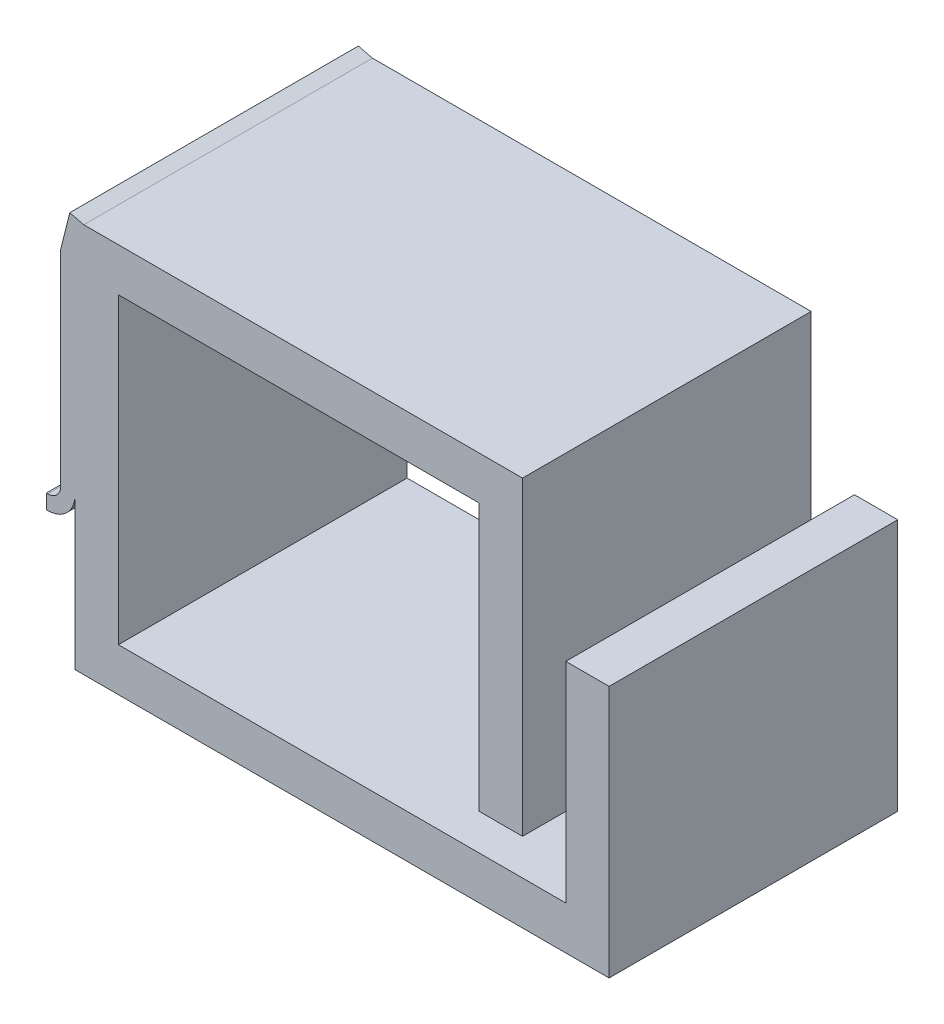
ISO-10303-21;
HEADER;
FILE_DESCRIPTION(('STEP AP214'),'2;1');
FILE_NAME('part.step','',(''),(''),'','','');
FILE_SCHEMA(('AUTOMOTIVE_DESIGN { 1 0 10303 214 1 1 1 1 }'));
ENDSEC;
DATA;
#1=APPLICATION_CONTEXT('core data for automotive mechanical design processes');
#2=APPLICATION_PROTOCOL_DEFINITION('international standard','automotive_design',2000,#1);
#3=PRODUCT_CONTEXT('',#1,'mechanical');
#4=PRODUCT('Part','Part','',(#3));
#5=PRODUCT_RELATED_PRODUCT_CATEGORY('part','',(#4));
#6=PRODUCT_DEFINITION_FORMATION('','',#4);
#7=PRODUCT_DEFINITION_CONTEXT('part definition',#1,'design');
#8=PRODUCT_DEFINITION('design','',#6,#7);
#9=PRODUCT_DEFINITION_SHAPE('','',#8);
#10=(LENGTH_UNIT() NAMED_UNIT(*) SI_UNIT(.MILLI.,.METRE.));
#11=(NAMED_UNIT(*) PLANE_ANGLE_UNIT() SI_UNIT($,.RADIAN.));
#12=(NAMED_UNIT(*) SI_UNIT($,.STERADIAN.) SOLID_ANGLE_UNIT());
#13=UNCERTAINTY_MEASURE_WITH_UNIT(LENGTH_MEASURE(1.E-05),#10,'distance_accuracy_value','');
#14=(GEOMETRIC_REPRESENTATION_CONTEXT(3) GLOBAL_UNCERTAINTY_ASSIGNED_CONTEXT((#13)) GLOBAL_UNIT_ASSIGNED_CONTEXT((#10,
#11,#12)) REPRESENTATION_CONTEXT('',''));
#15=CARTESIAN_POINT('',(0.,0.,0.));
#16=DIRECTION('',(0.,0.,1.));
#17=DIRECTION('',(1.,0.,0.));
#18=AXIS2_PLACEMENT_3D('',#15,#16,#17);
#19=CARTESIAN_POINT('',(-9.31410256410255,-0.450000000000002,10.));
#20=DIRECTION('',(1.,0.,0.));
#21=DIRECTION('',(0.,1.,0.));
#22=AXIS2_PLACEMENT_3D('',#19,#20,#21);
#23=PLANE('',#22);
#24=DIRECTION('',(0.,-1.,0.));
#25=VECTOR('',#24,1.);
#26=CARTESIAN_POINT('',(-9.31410256410255,-0.450000000000002,10.));
#27=LINE('',#26,#25);
#28=CARTESIAN_POINT('',(-9.31410256410255,-7.5,10.));
#29=VERTEX_POINT('',#28);
#30=CARTESIAN_POINT('',(-9.31410256410255,-12.75,10.));
#31=VERTEX_POINT('',#30);
#32=EDGE_CURVE('E108',#29,#31,#27,.T.);
#33=ORIENTED_EDGE('',*,*,#32,.F.);
#34=DIRECTION('',(0.,0.,1.));
#35=VECTOR('',#34,1.);
#36=CARTESIAN_POINT('',(-9.31410256410255,-7.5,0.));
#37=LINE('',#36,#35);
#38=CARTESIAN_POINT('',(-9.31410256410255,-7.5,0.));
#39=VERTEX_POINT('',#38);
#40=EDGE_CURVE('E103',#39,#29,#37,.T.);
#41=ORIENTED_EDGE('',*,*,#40,.F.);
#42=DIRECTION('',(0.,-1.,0.));
#43=VECTOR('',#42,1.);
#44=CARTESIAN_POINT('',(-9.31410256410255,-0.450000000000002,0.));
#45=LINE('',#44,#43);
#46=CARTESIAN_POINT('',(-9.31410256410255,-12.75,0.));
#47=VERTEX_POINT('',#46);
#48=EDGE_CURVE('E328',#39,#47,#45,.T.);
#49=ORIENTED_EDGE('',*,*,#48,.T.);
#50=DIRECTION('',(0.,0.,-1.));
#51=VECTOR('',#50,1.);
#52=CARTESIAN_POINT('',(-9.31410256410255,-12.75,10.));
#53=LINE('',#52,#51);
#54=EDGE_CURVE('E333',#31,#47,#53,.T.);
#55=ORIENTED_EDGE('',*,*,#54,.F.);
#56=EDGE_LOOP('',(#33,#41,#49,#55));
#57=FACE_BOUND('',#56,.T.);
#58=ADVANCED_FACE('F88',(#57),#23,.F.);
#59=CARTESIAN_POINT('',(-8.56410256410255,-12.75,10.));
#60=DIRECTION('',(0.,1.,0.));
#61=DIRECTION('',(0.,0.,1.));
#62=AXIS2_PLACEMENT_3D('',#59,#60,#61);
#63=PLANE('',#62);
#64=DIRECTION('',(1.,0.,0.));
#65=VECTOR('',#64,1.);
#66=CARTESIAN_POINT('',(-8.56410256410255,-12.75,0.));
#67=LINE('',#66,#65);
#68=CARTESIAN_POINT('',(9.18589743589745,-12.75,0.));
#69=VERTEX_POINT('',#68);
#70=EDGE_CURVE('E298',#47,#69,#67,.T.);
#71=ORIENTED_EDGE('',*,*,#70,.T.);
#72=DIRECTION('',(0.,0.,-1.));
#73=VECTOR('',#72,1.);
#74=CARTESIAN_POINT('',(9.18589743589745,-12.75,10.));
#75=LINE('',#74,#73);
#76=CARTESIAN_POINT('',(9.18589743589745,-12.75,10.));
#77=VERTEX_POINT('',#76);
#78=EDGE_CURVE('E312',#77,#69,#75,.T.);
#79=ORIENTED_EDGE('',*,*,#78,.F.);
#80=DIRECTION('',(1.,0.,0.));
#81=VECTOR('',#80,1.);
#82=CARTESIAN_POINT('',(-8.56410256410255,-12.75,10.));
#83=LINE('',#82,#81);
#84=EDGE_CURVE('E310',#31,#77,#83,.T.);
#85=ORIENTED_EDGE('',*,*,#84,.F.);
#86=ORIENTED_EDGE('',*,*,#54,.T.);
#87=EDGE_LOOP('',(#71,#79,#85,#86));
#88=FACE_BOUND('',#87,.T.);
#89=ADVANCED_FACE('F422',(#88),#63,.F.);
#90=CARTESIAN_POINT('',(9.18589743589745,-12.,10.));
#91=DIRECTION('',(-1.,0.,0.));
#92=DIRECTION('',(0.,0.,1.));
#93=AXIS2_PLACEMENT_3D('',#90,#91,#92);
#94=PLANE('',#93);
#95=DIRECTION('',(0.,1.,0.));
#96=VECTOR('',#95,1.);
#97=CARTESIAN_POINT('',(9.18589743589745,-12.,0.));
#98=LINE('',#97,#96);
#99=CARTESIAN_POINT('',(9.18589743589745,-4.,0.));
#100=VERTEX_POINT('',#99);
#101=EDGE_CURVE('E313',#69,#100,#98,.T.);
#102=ORIENTED_EDGE('',*,*,#101,.T.);
#103=DIRECTION('',(0.,0.,-1.));
#104=VECTOR('',#103,1.);
#105=CARTESIAN_POINT('',(9.18589743589745,-4.,10.));
#106=LINE('',#105,#104);
#107=CARTESIAN_POINT('',(9.18589743589745,-4.,10.));
#108=VERTEX_POINT('',#107);
#109=EDGE_CURVE('E96',#108,#100,#106,.T.);
#110=ORIENTED_EDGE('',*,*,#109,.F.);
#111=DIRECTION('',(0.,1.,0.));
#112=VECTOR('',#111,1.);
#113=CARTESIAN_POINT('',(9.18589743589745,-12.,10.));
#114=LINE('',#113,#112);
#115=EDGE_CURVE('E295',#77,#108,#114,.T.);
#116=ORIENTED_EDGE('',*,*,#115,.F.);
#117=ORIENTED_EDGE('',*,*,#78,.T.);
#118=EDGE_LOOP('',(#102,#110,#116,#117));
#119=FACE_BOUND('',#118,.T.);
#120=ADVANCED_FACE('F417',(#119),#94,.F.);
#121=CARTESIAN_POINT('',(7.68589743589745,-4.,10.));
#122=DIRECTION('',(0.,1.,0.));
#123=DIRECTION('',(0.,0.,1.));
#124=AXIS2_PLACEMENT_3D('',#121,#122,#123);
#125=PLANE('',#124);
#126=DIRECTION('',(1.,0.,0.));
#127=VECTOR('',#126,1.);
#128=CARTESIAN_POINT('',(7.68589743589745,-4.,0.));
#129=LINE('',#128,#127);
#130=CARTESIAN_POINT('',(7.68589743589745,-4.,0.));
#131=VERTEX_POINT('',#130);
#132=EDGE_CURVE('E316',#131,#100,#129,.T.);
#133=ORIENTED_EDGE('',*,*,#132,.F.);
#134=DIRECTION('',(0.,0.,-1.));
#135=VECTOR('',#134,1.);
#136=CARTESIAN_POINT('',(7.68589743589745,-4.,10.));
#137=LINE('',#136,#135);
#138=CARTESIAN_POINT('',(7.68589743589745,-4.,10.));
#139=VERTEX_POINT('',#138);
#140=EDGE_CURVE('E344',#139,#131,#137,.T.);
#141=ORIENTED_EDGE('',*,*,#140,.F.);
#142=DIRECTION('',(1.,0.,0.));
#143=VECTOR('',#142,1.);
#144=CARTESIAN_POINT('',(7.68589743589745,-4.,10.));
#145=LINE('',#144,#143);
#146=EDGE_CURVE('E297',#139,#108,#145,.T.);
#147=ORIENTED_EDGE('',*,*,#146,.T.);
#148=ORIENTED_EDGE('',*,*,#109,.T.);
#149=EDGE_LOOP('',(#133,#141,#147,#148));
#150=FACE_BOUND('',#149,.T.);
#151=ADVANCED_FACE('F413',(#150),#125,.T.);
#152=CARTESIAN_POINT('',(7.68589743589745,-12.,10.));
#153=DIRECTION('',(-1.,0.,0.));
#154=DIRECTION('',(0.,0.,1.));
#155=AXIS2_PLACEMENT_3D('',#152,#153,#154);
#156=PLANE('',#155);
#157=DIRECTION('',(0.,1.,0.));
#158=VECTOR('',#157,1.);
#159=CARTESIAN_POINT('',(7.68589743589745,-12.,0.));
#160=LINE('',#159,#158);
#161=CARTESIAN_POINT('',(7.68589743589745,-11.25,0.));
#162=VERTEX_POINT('',#161);
#163=EDGE_CURVE('E320',#162,#131,#160,.T.);
#164=ORIENTED_EDGE('',*,*,#163,.F.);
#165=DIRECTION('',(0.,0.,-1.));
#166=VECTOR('',#165,1.);
#167=CARTESIAN_POINT('',(7.68589743589745,-11.25,10.));
#168=LINE('',#167,#166);
#169=CARTESIAN_POINT('',(7.68589743589745,-11.25,10.));
#170=VERTEX_POINT('',#169);
#171=EDGE_CURVE('E342',#170,#162,#168,.T.);
#172=ORIENTED_EDGE('',*,*,#171,.F.);
#173=DIRECTION('',(0.,1.,0.));
#174=VECTOR('',#173,1.);
#175=CARTESIAN_POINT('',(7.68589743589745,-12.,10.));
#176=LINE('',#175,#174);
#177=EDGE_CURVE('E301',#170,#139,#176,.T.);
#178=ORIENTED_EDGE('',*,*,#177,.T.);
#179=ORIENTED_EDGE('',*,*,#140,.T.);
#180=EDGE_LOOP('',(#164,#172,#178,#179));
#181=FACE_BOUND('',#180,.T.);
#182=ADVANCED_FACE('F410',(#181),#156,.T.);
#183=CARTESIAN_POINT('',(-8.56410256410255,-11.25,10.));
#184=DIRECTION('',(0.,1.,0.));
#185=DIRECTION('',(0.,0.,1.));
#186=AXIS2_PLACEMENT_3D('',#183,#184,#185);
#187=PLANE('',#186);
#188=DIRECTION('',(1.,0.,0.));
#189=VECTOR('',#188,1.);
#190=CARTESIAN_POINT('',(-8.56410256410255,-11.25,0.));
#191=LINE('',#190,#189);
#192=CARTESIAN_POINT('',(-7.81410256410255,-11.25,0.));
#193=VERTEX_POINT('',#192);
#194=EDGE_CURVE('E323',#193,#162,#191,.T.);
#195=ORIENTED_EDGE('',*,*,#194,.F.);
#196=DIRECTION('',(0.,0.,-1.));
#197=VECTOR('',#196,1.);
#198=CARTESIAN_POINT('',(-7.81410256410255,-11.25,10.));
#199=LINE('',#198,#197);
#200=CARTESIAN_POINT('',(-7.81410256410255,-11.25,10.));
#201=VERTEX_POINT('',#200);
#202=EDGE_CURVE('E339',#201,#193,#199,.T.);
#203=ORIENTED_EDGE('',*,*,#202,.F.);
#204=DIRECTION('',(1.,0.,0.));
#205=VECTOR('',#204,1.);
#206=CARTESIAN_POINT('',(-8.56410256410255,-11.25,10.));
#207=LINE('',#206,#205);
#208=EDGE_CURVE('E304',#201,#170,#207,.T.);
#209=ORIENTED_EDGE('',*,*,#208,.T.);
#210=ORIENTED_EDGE('',*,*,#171,.T.);
#211=EDGE_LOOP('',(#195,#203,#209,#210));
#212=FACE_BOUND('',#211,.T.);
#213=ADVANCED_FACE('F405',(#212),#187,.T.);
#214=CARTESIAN_POINT('',(-7.81410256410255,-0.450000000000002,10.));
#215=DIRECTION('',(1.,0.,0.));
#216=DIRECTION('',(0.,1.,0.));
#217=AXIS2_PLACEMENT_3D('',#214,#215,#216);
#218=PLANE('',#217);
#219=DIRECTION('',(0.,0.,-1.));
#220=VECTOR('',#219,1.);
#221=CARTESIAN_POINT('',(-7.81410256410255,-0.750000000000002,10.));
#222=LINE('',#221,#220);
#223=CARTESIAN_POINT('',(-7.81410256410255,-0.750000000000001,10.));
#224=VERTEX_POINT('',#223);
#225=CARTESIAN_POINT('',(-7.81410256410255,-0.750000000000001,0.));
#226=VERTEX_POINT('',#225);
#227=EDGE_CURVE('E12',#224,#226,#222,.T.);
#228=ORIENTED_EDGE('',*,*,#227,.F.);
#229=DIRECTION('',(0.,-1.,0.));
#230=VECTOR('',#229,1.);
#231=CARTESIAN_POINT('',(-7.81410256410255,-0.450000000000002,10.));
#232=LINE('',#231,#230);
#233=EDGE_CURVE('E307',#224,#201,#232,.T.);
#234=ORIENTED_EDGE('',*,*,#233,.T.);
#235=ORIENTED_EDGE('',*,*,#202,.T.);
#236=DIRECTION('',(0.,-1.,0.));
#237=VECTOR('',#236,1.);
#238=CARTESIAN_POINT('',(-7.81410256410255,-0.450000000000002,0.));
#239=LINE('',#238,#237);
#240=EDGE_CURVE('E326',#226,#193,#239,.T.);
#241=ORIENTED_EDGE('',*,*,#240,.F.);
#242=EDGE_LOOP('',(#228,#234,#235,#241));
#243=FACE_BOUND('',#242,.T.);
#244=ADVANCED_FACE('F402',(#243),#218,.T.);
#245=CARTESIAN_POINT('',(-9.01410256410256,-0.450000000000002,0.));
#246=DIRECTION('',(0.,0.,1.));
#247=DIRECTION('',(1.,0.,0.));
#248=AXIS2_PLACEMENT_3D('',#245,#246,#247);
#249=PLANE('',#248);
#250=DIRECTION('',(0.970142500145333,-0.24253562503633,0.));
#251=VECTOR('',#250,1.);
#252=CARTESIAN_POINT('',(-9.49917381417522,0.871267812518165,0.));
#253=LINE('',#252,#251);
#254=CARTESIAN_POINT('',(-9.49917381417522,0.871267812518165,0.));
#255=VERTEX_POINT('',#254);
#256=CARTESIAN_POINT('',(-9.01410256410256,0.75,0.));
#257=VERTEX_POINT('',#256);
#258=EDGE_CURVE('E258',#255,#257,#253,.T.);
#259=ORIENTED_EDGE('',*,*,#258,.T.);
#260=DIRECTION('',(-1.,0.,0.));
#261=VECTOR('',#260,1.);
#262=CARTESIAN_POINT('',(5.43589743589745,0.75,0.));
#263=LINE('',#262,#261);
#264=CARTESIAN_POINT('',(6.18589743589745,0.75,0.));
#265=VERTEX_POINT('',#264);
#266=EDGE_CURVE('E351',#265,#257,#263,.T.);
#267=ORIENTED_EDGE('',*,*,#266,.F.);
#268=DIRECTION('',(0.,1.,0.));
#269=VECTOR('',#268,1.);
#270=CARTESIAN_POINT('',(6.18589743589745,0.,0.));
#271=LINE('',#270,#269);
#272=CARTESIAN_POINT('',(6.18589743589745,-10.,0.));
#273=VERTEX_POINT('',#272);
#274=EDGE_CURVE('E372',#273,#265,#271,.T.);
#275=ORIENTED_EDGE('',*,*,#274,.F.);
#276=DIRECTION('',(-1.,0.,0.));
#277=VECTOR('',#276,1.);
#278=CARTESIAN_POINT('',(6.18589743589745,-10.,0.));
#279=LINE('',#278,#277);
#280=CARTESIAN_POINT('',(4.68589743589745,-10.,0.));
#281=VERTEX_POINT('',#280);
#282=EDGE_CURVE('E369',#273,#281,#279,.T.);
#283=ORIENTED_EDGE('',*,*,#282,.T.);
#284=DIRECTION('',(0.,1.,0.));
#285=VECTOR('',#284,1.);
#286=CARTESIAN_POINT('',(4.68589743589745,0.,0.));
#287=LINE('',#286,#285);
#288=CARTESIAN_POINT('',(4.68589743589745,-0.75,0.));
#289=VERTEX_POINT('',#288);
#290=EDGE_CURVE('E366',#281,#289,#287,.T.);
#291=ORIENTED_EDGE('',*,*,#290,.T.);
#292=DIRECTION('',(-1.,0.,0.));
#293=VECTOR('',#292,1.);
#294=CARTESIAN_POINT('',(5.43589743589745,-0.75,0.));
#295=LINE('',#294,#293);
#296=EDGE_CURVE('E283',#289,#226,#295,.T.);
#297=ORIENTED_EDGE('',*,*,#296,.T.);
#298=ORIENTED_EDGE('',*,*,#240,.T.);
#299=ORIENTED_EDGE('',*,*,#194,.T.);
#300=ORIENTED_EDGE('',*,*,#163,.T.);
#301=ORIENTED_EDGE('',*,*,#132,.T.);
#302=ORIENTED_EDGE('',*,*,#101,.F.);
#303=ORIENTED_EDGE('',*,*,#70,.F.);
#304=ORIENTED_EDGE('',*,*,#48,.F.);
#305=CARTESIAN_POINT('',(-10.2641025641026,-7.5,0.));
#306=DIRECTION('',(0.,0.,-1.));
#307=DIRECTION('',(-1.,0.,0.));
#308=AXIS2_PLACEMENT_3D('',#305,#306,#307);
#309=CIRCLE('',#308,0.950000000000001);
#310=CARTESIAN_POINT('',(-10.2641025641026,-8.45,0.));
#311=VERTEX_POINT('',#310);
#312=EDGE_CURVE('E256',#39,#311,#309,.T.);
#313=ORIENTED_EDGE('',*,*,#312,.T.);
#314=DIRECTION('',(-1.,0.,0.));
#315=VECTOR('',#314,1.);
#316=CARTESIAN_POINT('',(-10.2641025641026,-8.45,0.));
#317=LINE('',#316,#315);
#318=CARTESIAN_POINT('',(-10.3141025641025,-8.45,0.));
#319=VERTEX_POINT('',#318);
#320=EDGE_CURVE('E231',#311,#319,#317,.T.);
#321=ORIENTED_EDGE('',*,*,#320,.T.);
#322=DIRECTION('',(0.,1.,0.));
#323=VECTOR('',#322,1.);
#324=CARTESIAN_POINT('',(-10.3141025641025,-8.45,0.));
#325=LINE('',#324,#323);
#326=CARTESIAN_POINT('',(-10.3141025641025,-7.95,0.));
#327=VERTEX_POINT('',#326);
#328=EDGE_CURVE('E222',#319,#327,#325,.T.);
#329=ORIENTED_EDGE('',*,*,#328,.T.);
#330=DIRECTION('',(-1.,0.,0.));
#331=VECTOR('',#330,1.);
#332=CARTESIAN_POINT('',(-10.2641025641025,-7.95,0.));
#333=LINE('',#332,#331);
#334=CARTESIAN_POINT('',(-10.2641025641025,-7.95,0.));
#335=VERTEX_POINT('',#334);
#336=EDGE_CURVE('E228',#335,#327,#333,.T.);
#337=ORIENTED_EDGE('',*,*,#336,.F.);
#338=CARTESIAN_POINT('',(-10.2641025641026,-7.5,0.));
#339=DIRECTION('',(0.,0.,1.));
#340=DIRECTION('',(1.,0.,0.));
#341=AXIS2_PLACEMENT_3D('',#338,#339,#340);
#342=CIRCLE('',#341,0.450000000000001);
#343=CARTESIAN_POINT('',(-9.81410256410255,-7.5,0.));
#344=VERTEX_POINT('',#343);
#345=EDGE_CURVE('E245',#344,#335,#342,.F.);
#346=ORIENTED_EDGE('',*,*,#345,.F.);
#347=DIRECTION('',(0.,-1.,0.));
#348=VECTOR('',#347,1.);
#349=CARTESIAN_POINT('',(-9.81410256410255,-0.450000000000002,0.));
#350=LINE('',#349,#348);
#351=CARTESIAN_POINT('',(-9.81410256410255,-0.388447187191176,0.));
#352=VERTEX_POINT('',#351);
#353=EDGE_CURVE('E263',#352,#344,#350,.T.);
#354=ORIENTED_EDGE('',*,*,#353,.F.);
#355=DIRECTION('',(-0.24253562503633,-0.970142500145333,0.));
#356=VECTOR('',#355,1.);
#357=CARTESIAN_POINT('',(-9.49917381417522,0.871267812518165,0.));
#358=LINE('',#357,#356);
#359=EDGE_CURVE('E260',#255,#352,#358,.T.);
#360=ORIENTED_EDGE('',*,*,#359,.F.);
#361=EDGE_LOOP('',(#259,#267,#275,#283,#291,#297,#298,#299,#300,#301,#302,#303,#304,#313,#321,
#329,#337,#346,#354,#360));
#362=FACE_BOUND('',#361,.T.);
#363=ADVANCED_FACE('F225',(#362),#249,.F.);
#364=CARTESIAN_POINT('',(-9.01410256410256,-0.450000000000002,10.));
#365=DIRECTION('',(0.,0.,1.));
#366=DIRECTION('',(1.,0.,0.));
#367=AXIS2_PLACEMENT_3D('',#364,#365,#366);
#368=PLANE('',#367);
#369=DIRECTION('',(-1.,0.,0.));
#370=VECTOR('',#369,1.);
#371=CARTESIAN_POINT('',(-8.56410256410255,0.749999999999998,10.));
#372=LINE('',#371,#370);
#373=CARTESIAN_POINT('',(6.18589743589745,0.75,10.));
#374=VERTEX_POINT('',#373);
#375=CARTESIAN_POINT('',(-9.01410256410256,0.75,10.));
#376=VERTEX_POINT('',#375);
#377=EDGE_CURVE('E347',#374,#376,#372,.T.);
#378=ORIENTED_EDGE('',*,*,#377,.T.);
#379=DIRECTION('',(0.970142500145333,-0.24253562503633,0.));
#380=VECTOR('',#379,1.);
#381=CARTESIAN_POINT('',(-9.49917381417522,0.871267812518165,10.));
#382=LINE('',#381,#380);
#383=CARTESIAN_POINT('',(-9.49917381417522,0.871267812518165,10.));
#384=VERTEX_POINT('',#383);
#385=EDGE_CURVE('E274',#384,#376,#382,.T.);
#386=ORIENTED_EDGE('',*,*,#385,.F.);
#387=DIRECTION('',(-0.24253562503633,-0.970142500145333,0.));
#388=VECTOR('',#387,1.);
#389=CARTESIAN_POINT('',(-9.49917381417522,0.871267812518165,10.));
#390=LINE('',#389,#388);
#391=CARTESIAN_POINT('',(-9.81410256410255,-0.388447187191176,10.));
#392=VERTEX_POINT('',#391);
#393=EDGE_CURVE('E277',#384,#392,#390,.T.);
#394=ORIENTED_EDGE('',*,*,#393,.T.);
#395=DIRECTION('',(0.,-1.,0.));
#396=VECTOR('',#395,1.);
#397=CARTESIAN_POINT('',(-9.81410256410255,-0.450000000000002,10.));
#398=LINE('',#397,#396);
#399=CARTESIAN_POINT('',(-9.81410256410255,-7.5,10.));
#400=VERTEX_POINT('',#399);
#401=EDGE_CURVE('E252',#392,#400,#398,.T.);
#402=ORIENTED_EDGE('',*,*,#401,.T.);
#403=CARTESIAN_POINT('',(-10.2641025641026,-7.5,10.));
#404=DIRECTION('',(0.,0.,1.));
#405=DIRECTION('',(1.,0.,0.));
#406=AXIS2_PLACEMENT_3D('',#403,#404,#405);
#407=CIRCLE('',#406,0.450000000000001);
#408=CARTESIAN_POINT('',(-10.2641025641025,-7.95,10.));
#409=VERTEX_POINT('',#408);
#410=EDGE_CURVE('E249',#400,#409,#407,.F.);
#411=ORIENTED_EDGE('',*,*,#410,.T.);
#412=DIRECTION('',(-1.,0.,0.));
#413=VECTOR('',#412,1.);
#414=CARTESIAN_POINT('',(-10.2641025641025,-7.95,10.));
#415=LINE('',#414,#413);
#416=CARTESIAN_POINT('',(-10.3141025641025,-7.95,10.));
#417=VERTEX_POINT('',#416);
#418=EDGE_CURVE('E267',#409,#417,#415,.T.);
#419=ORIENTED_EDGE('',*,*,#418,.T.);
#420=DIRECTION('',(0.,1.,0.));
#421=VECTOR('',#420,1.);
#422=CARTESIAN_POINT('',(-10.3141025641025,-8.45,10.));
#423=LINE('',#422,#421);
#424=CARTESIAN_POINT('',(-10.3141025641025,-8.45,10.));
#425=VERTEX_POINT('',#424);
#426=EDGE_CURVE('E240',#425,#417,#423,.T.);
#427=ORIENTED_EDGE('',*,*,#426,.F.);
#428=DIRECTION('',(-1.,0.,0.));
#429=VECTOR('',#428,1.);
#430=CARTESIAN_POINT('',(-10.2641025641026,-8.45,10.));
#431=LINE('',#430,#429);
#432=CARTESIAN_POINT('',(-10.2641025641026,-8.45,10.));
#433=VERTEX_POINT('',#432);
#434=EDGE_CURVE('E270',#433,#425,#431,.T.);
#435=ORIENTED_EDGE('',*,*,#434,.F.);
#436=CARTESIAN_POINT('',(-10.2641025641026,-7.5,10.));
#437=DIRECTION('',(0.,0.,-1.));
#438=DIRECTION('',(-1.,0.,0.));
#439=AXIS2_PLACEMENT_3D('',#436,#437,#438);
#440=CIRCLE('',#439,0.950000000000001);
#441=EDGE_CURVE('E272',#29,#433,#440,.T.);
#442=ORIENTED_EDGE('',*,*,#441,.F.);
#443=ORIENTED_EDGE('',*,*,#32,.T.);
#444=ORIENTED_EDGE('',*,*,#84,.T.);
#445=ORIENTED_EDGE('',*,*,#115,.T.);
#446=ORIENTED_EDGE('',*,*,#146,.F.);
#447=ORIENTED_EDGE('',*,*,#177,.F.);
#448=ORIENTED_EDGE('',*,*,#208,.F.);
#449=ORIENTED_EDGE('',*,*,#233,.F.);
#450=DIRECTION('',(-1.,0.,0.));
#451=VECTOR('',#450,1.);
#452=CARTESIAN_POINT('',(-8.56410256410255,-0.750000000000002,10.));
#453=LINE('',#452,#451);
#454=CARTESIAN_POINT('',(4.68589743589745,-0.75,10.));
#455=VERTEX_POINT('',#454);
#456=EDGE_CURVE('E350',#455,#224,#453,.T.);
#457=ORIENTED_EDGE('',*,*,#456,.F.);
#458=DIRECTION('',(0.,1.,0.));
#459=VECTOR('',#458,1.);
#460=CARTESIAN_POINT('',(4.68589743589745,0.,10.));
#461=LINE('',#460,#459);
#462=CARTESIAN_POINT('',(4.68589743589745,-10.,10.));
#463=VERTEX_POINT('',#462);
#464=EDGE_CURVE('E354',#463,#455,#461,.T.);
#465=ORIENTED_EDGE('',*,*,#464,.F.);
#466=DIRECTION('',(-1.,0.,0.));
#467=VECTOR('',#466,1.);
#468=CARTESIAN_POINT('',(6.18589743589745,-10.,10.));
#469=LINE('',#468,#467);
#470=CARTESIAN_POINT('',(6.18589743589745,-10.,10.));
#471=VERTEX_POINT('',#470);
#472=EDGE_CURVE('E357',#471,#463,#469,.T.);
#473=ORIENTED_EDGE('',*,*,#472,.F.);
#474=DIRECTION('',(0.,1.,0.));
#475=VECTOR('',#474,1.);
#476=CARTESIAN_POINT('',(6.18589743589745,0.,10.));
#477=LINE('',#476,#475);
#478=EDGE_CURVE('E360',#471,#374,#477,.T.);
#479=ORIENTED_EDGE('',*,*,#478,.T.);
#480=EDGE_LOOP('',(#378,#386,#394,#402,#411,#419,#427,#435,#442,#443,#444,#445,#446,#447,#448,
#449,#457,#465,#473,#479));
#481=FACE_BOUND('',#480,.T.);
#482=ADVANCED_FACE('F396',(#481),#368,.T.);
#483=CARTESIAN_POINT('',(4.68589743589745,0.,10.));
#484=DIRECTION('',(-1.,0.,0.));
#485=DIRECTION('',(0.,-1.,0.));
#486=AXIS2_PLACEMENT_3D('',#483,#484,#485);
#487=PLANE('',#486);
#488=ORIENTED_EDGE('',*,*,#290,.F.);
#489=DIRECTION('',(0.,0.,-1.));
#490=VECTOR('',#489,1.);
#491=CARTESIAN_POINT('',(4.68589743589745,-10.,10.));
#492=LINE('',#491,#490);
#493=EDGE_CURVE('E379',#463,#281,#492,.T.);
#494=ORIENTED_EDGE('',*,*,#493,.F.);
#495=ORIENTED_EDGE('',*,*,#464,.T.);
#496=DIRECTION('',(0.,0.,-1.));
#497=VECTOR('',#496,1.);
#498=CARTESIAN_POINT('',(4.68589743589745,-0.75,10.));
#499=LINE('',#498,#497);
#500=EDGE_CURVE('E317',#455,#289,#499,.T.);
#501=ORIENTED_EDGE('',*,*,#500,.T.);
#502=EDGE_LOOP('',(#488,#494,#495,#501));
#503=FACE_BOUND('',#502,.T.);
#504=ADVANCED_FACE('F384',(#503),#487,.T.);
#505=CARTESIAN_POINT('',(6.18589743589745,-10.,10.));
#506=DIRECTION('',(0.,-1.,0.));
#507=DIRECTION('',(0.,0.,-1.));
#508=AXIS2_PLACEMENT_3D('',#505,#506,#507);
#509=PLANE('',#508);
#510=ORIENTED_EDGE('',*,*,#282,.F.);
#511=DIRECTION('',(0.,0.,-1.));
#512=VECTOR('',#511,1.);
#513=CARTESIAN_POINT('',(6.18589743589745,-10.,10.));
#514=LINE('',#513,#512);
#515=EDGE_CURVE('E377',#471,#273,#514,.T.);
#516=ORIENTED_EDGE('',*,*,#515,.F.);
#517=ORIENTED_EDGE('',*,*,#472,.T.);
#518=ORIENTED_EDGE('',*,*,#493,.T.);
#519=EDGE_LOOP('',(#510,#516,#517,#518));
#520=FACE_BOUND('',#519,.T.);
#521=ADVANCED_FACE('F392',(#520),#509,.T.);
#522=CARTESIAN_POINT('',(5.43589743589745,-0.75,10.));
#523=DIRECTION('',(0.,-1.,0.));
#524=DIRECTION('',(1.,0.,0.));
#525=AXIS2_PLACEMENT_3D('',#522,#523,#524);
#526=PLANE('',#525);
#527=ORIENTED_EDGE('',*,*,#456,.T.);
#528=ORIENTED_EDGE('',*,*,#227,.T.);
#529=ORIENTED_EDGE('',*,*,#296,.F.);
#530=ORIENTED_EDGE('',*,*,#500,.F.);
#531=EDGE_LOOP('',(#527,#528,#529,#530));
#532=FACE_BOUND('',#531,.T.);
#533=ADVANCED_FACE('F90',(#532),#526,.T.);
#534=CARTESIAN_POINT('',(6.18589743589745,0.,10.));
#535=DIRECTION('',(-1.,0.,0.));
#536=DIRECTION('',(0.,-1.,0.));
#537=AXIS2_PLACEMENT_3D('',#534,#535,#536);
#538=PLANE('',#537);
#539=ORIENTED_EDGE('',*,*,#274,.T.);
#540=DIRECTION('',(0.,0.,-1.));
#541=VECTOR('',#540,1.);
#542=CARTESIAN_POINT('',(6.18589743589745,0.75,10.));
#543=LINE('',#542,#541);
#544=EDGE_CURVE('E363',#374,#265,#543,.T.);
#545=ORIENTED_EDGE('',*,*,#544,.F.);
#546=ORIENTED_EDGE('',*,*,#478,.F.);
#547=ORIENTED_EDGE('',*,*,#515,.T.);
#548=EDGE_LOOP('',(#539,#545,#546,#547));
#549=FACE_BOUND('',#548,.T.);
#550=ADVANCED_FACE('F445',(#549),#538,.F.);
#551=CARTESIAN_POINT('',(5.43589743589745,0.75,10.));
#552=DIRECTION('',(0.,-1.,0.));
#553=DIRECTION('',(1.,0.,0.));
#554=AXIS2_PLACEMENT_3D('',#551,#552,#553);
#555=PLANE('',#554);
#556=ORIENTED_EDGE('',*,*,#266,.T.);
#557=DIRECTION('',(0.,0.,-1.));
#558=VECTOR('',#557,1.);
#559=CARTESIAN_POINT('',(-9.01410256410256,0.75,10.));
#560=LINE('',#559,#558);
#561=EDGE_CURVE('E336',#376,#257,#560,.T.);
#562=ORIENTED_EDGE('',*,*,#561,.F.);
#563=ORIENTED_EDGE('',*,*,#377,.F.);
#564=ORIENTED_EDGE('',*,*,#544,.T.);
#565=EDGE_LOOP('',(#556,#562,#563,#564));
#566=FACE_BOUND('',#565,.T.);
#567=ADVANCED_FACE('F442',(#566),#555,.F.);
#568=CARTESIAN_POINT('',(-10.2641025641025,-7.95,0.));
#569=DIRECTION('',(0.,1.,0.));
#570=DIRECTION('',(-1.,0.,0.));
#571=AXIS2_PLACEMENT_3D('',#568,#569,#570);
#572=PLANE('',#571);
#573=ORIENTED_EDGE('',*,*,#418,.F.);
#574=DIRECTION('',(0.,0.,1.));
#575=VECTOR('',#574,1.);
#576=CARTESIAN_POINT('',(-10.2641025641025,-7.95,0.));
#577=LINE('',#576,#575);
#578=EDGE_CURVE('E248',#335,#409,#577,.T.);
#579=ORIENTED_EDGE('',*,*,#578,.F.);
#580=ORIENTED_EDGE('',*,*,#336,.T.);
#581=DIRECTION('',(0.,0.,1.));
#582=VECTOR('',#581,1.);
#583=CARTESIAN_POINT('',(-10.3141025641025,-7.95,0.));
#584=LINE('',#583,#582);
#585=EDGE_CURVE('E237',#327,#417,#584,.T.);
#586=ORIENTED_EDGE('',*,*,#585,.T.);
#587=EDGE_LOOP('',(#573,#579,#580,#586));
#588=FACE_BOUND('',#587,.T.);
#589=ADVANCED_FACE('F247',(#588),#572,.T.);
#590=CARTESIAN_POINT('',(-10.2641025641026,-7.5,0.));
#591=DIRECTION('',(0.,0.,1.));
#592=DIRECTION('',(1.,0.,0.));
#593=AXIS2_PLACEMENT_3D('',#590,#591,#592);
#594=CYLINDRICAL_SURFACE('',#593,0.450000000000001);
#595=ORIENTED_EDGE('',*,*,#410,.F.);
#596=DIRECTION('',(0.,0.,1.));
#597=VECTOR('',#596,1.);
#598=CARTESIAN_POINT('',(-9.81410256410255,-7.5,0.));
#599=LINE('',#598,#597);
#600=EDGE_CURVE('E284',#344,#400,#599,.T.);
#601=ORIENTED_EDGE('',*,*,#600,.F.);
#602=ORIENTED_EDGE('',*,*,#345,.T.);
#603=ORIENTED_EDGE('',*,*,#578,.T.);
#604=EDGE_LOOP('',(#595,#601,#602,#603));
#605=FACE_BOUND('',#604,.T.);
#606=ADVANCED_FACE('F476',(#605),#594,.F.);
#607=CARTESIAN_POINT('',(-9.81410256410255,-0.450000000000002,0.));
#608=DIRECTION('',(-1.,0.,0.));
#609=DIRECTION('',(0.,-1.,0.));
#610=AXIS2_PLACEMENT_3D('',#607,#608,#609);
#611=PLANE('',#610);
#612=ORIENTED_EDGE('',*,*,#401,.F.);
#613=DIRECTION('',(0.,0.,1.));
#614=VECTOR('',#613,1.);
#615=CARTESIAN_POINT('',(-9.81410256410255,-0.388447187191176,0.));
#616=LINE('',#615,#614);
#617=EDGE_CURVE('E286',#352,#392,#616,.T.);
#618=ORIENTED_EDGE('',*,*,#617,.F.);
#619=ORIENTED_EDGE('',*,*,#353,.T.);
#620=ORIENTED_EDGE('',*,*,#600,.T.);
#621=EDGE_LOOP('',(#612,#618,#619,#620));
#622=FACE_BOUND('',#621,.T.);
#623=ADVANCED_FACE('F483',(#622),#611,.T.);
#624=CARTESIAN_POINT('',(-9.49917381417522,0.871267812518165,0.));
#625=DIRECTION('',(-0.970142500145333,0.24253562503633,0.));
#626=DIRECTION('',(-0.24253562503633,-0.970142500145333,0.));
#627=AXIS2_PLACEMENT_3D('',#624,#625,#626);
#628=PLANE('',#627);
#629=ORIENTED_EDGE('',*,*,#393,.F.);
#630=DIRECTION('',(0.,0.,1.));
#631=VECTOR('',#630,1.);
#632=CARTESIAN_POINT('',(-9.49917381417522,0.871267812518165,0.));
#633=LINE('',#632,#631);
#634=EDGE_CURVE('E288',#255,#384,#633,.T.);
#635=ORIENTED_EDGE('',*,*,#634,.F.);
#636=ORIENTED_EDGE('',*,*,#359,.T.);
#637=ORIENTED_EDGE('',*,*,#617,.T.);
#638=EDGE_LOOP('',(#629,#635,#636,#637));
#639=FACE_BOUND('',#638,.T.);
#640=ADVANCED_FACE('F491',(#639),#628,.T.);
#641=CARTESIAN_POINT('',(-9.49917381417522,0.871267812518165,0.));
#642=DIRECTION('',(-0.24253562503633,-0.970142500145333,0.));
#643=DIRECTION('',(0.970142500145333,-0.24253562503633,0.));
#644=AXIS2_PLACEMENT_3D('',#641,#642,#643);
#645=PLANE('',#644);
#646=ORIENTED_EDGE('',*,*,#385,.T.);
#647=ORIENTED_EDGE('',*,*,#561,.T.);
#648=ORIENTED_EDGE('',*,*,#258,.F.);
#649=ORIENTED_EDGE('',*,*,#634,.T.);
#650=EDGE_LOOP('',(#646,#647,#648,#649));
#651=FACE_BOUND('',#650,.T.);
#652=ADVANCED_FACE('F499',(#651),#645,.F.);
#653=CARTESIAN_POINT('',(-10.2641025641026,-7.5,0.));
#654=DIRECTION('',(0.,0.,1.));
#655=DIRECTION('',(1.,0.,0.));
#656=AXIS2_PLACEMENT_3D('',#653,#654,#655);
#657=CYLINDRICAL_SURFACE('',#656,0.950000000000001);
#658=ORIENTED_EDGE('',*,*,#441,.T.);
#659=DIRECTION('',(0.,0.,1.));
#660=VECTOR('',#659,1.);
#661=CARTESIAN_POINT('',(-10.2641025641026,-8.45,0.));
#662=LINE('',#661,#660);
#663=EDGE_CURVE('E291',#311,#433,#662,.T.);
#664=ORIENTED_EDGE('',*,*,#663,.F.);
#665=ORIENTED_EDGE('',*,*,#312,.F.);
#666=ORIENTED_EDGE('',*,*,#40,.T.);
#667=EDGE_LOOP('',(#658,#664,#665,#666));
#668=FACE_BOUND('',#667,.T.);
#669=ADVANCED_FACE('F507',(#668),#657,.T.);
#670=CARTESIAN_POINT('',(-10.2641025641026,-8.45,0.));
#671=DIRECTION('',(0.,1.,0.));
#672=DIRECTION('',(-1.,0.,0.));
#673=AXIS2_PLACEMENT_3D('',#670,#671,#672);
#674=PLANE('',#673);
#675=ORIENTED_EDGE('',*,*,#434,.T.);
#676=DIRECTION('',(0.,0.,1.));
#677=VECTOR('',#676,1.);
#678=CARTESIAN_POINT('',(-10.3141025641025,-8.45,0.));
#679=LINE('',#678,#677);
#680=EDGE_CURVE('E244',#319,#425,#679,.T.);
#681=ORIENTED_EDGE('',*,*,#680,.F.);
#682=ORIENTED_EDGE('',*,*,#320,.F.);
#683=ORIENTED_EDGE('',*,*,#663,.T.);
#684=EDGE_LOOP('',(#675,#681,#682,#683));
#685=FACE_BOUND('',#684,.T.);
#686=ADVANCED_FACE('F515',(#685),#674,.F.);
#687=CARTESIAN_POINT('',(-10.3141025641025,-8.45,0.));
#688=DIRECTION('',(1.,0.,0.));
#689=DIRECTION('',(0.,1.,0.));
#690=AXIS2_PLACEMENT_3D('',#687,#688,#689);
#691=PLANE('',#690);
#692=ORIENTED_EDGE('',*,*,#426,.T.);
#693=ORIENTED_EDGE('',*,*,#585,.F.);
#694=ORIENTED_EDGE('',*,*,#328,.F.);
#695=ORIENTED_EDGE('',*,*,#680,.T.);
#696=EDGE_LOOP('',(#692,#693,#694,#695));
#697=FACE_BOUND('',#696,.T.);
#698=ADVANCED_FACE('F238',(#697),#691,.F.);
#699=CLOSED_SHELL('',(#58,#89,#120,#151,#182,#213,#244,#363,#482,#504,#521,#533,#550,#567,#589,
#606,#623,#640,#652,#669,#686,#698));
#700=MANIFOLD_SOLID_BREP('B2',#699);
#701=ADVANCED_BREP_SHAPE_REPRESENTATION('',(#18,#700),#14);
#702=SHAPE_DEFINITION_REPRESENTATION(#9,#701);
ENDSEC;
END-ISO-10303-21;
